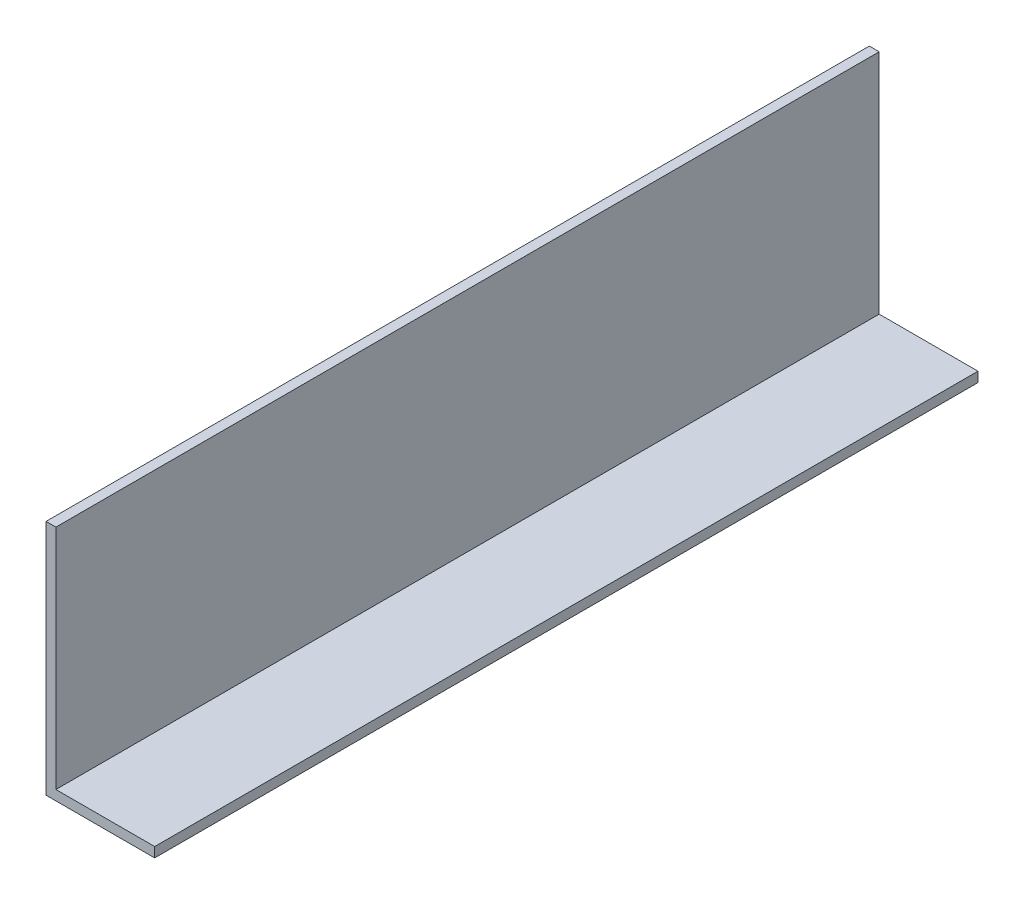
ISO-10303-21;
HEADER;
FILE_DESCRIPTION(('STEP AP214'),'2;1');
FILE_NAME('part.step','',(''),(''),'','','');
FILE_SCHEMA(('AUTOMOTIVE_DESIGN { 1 0 10303 214 1 1 1 1 }'));
ENDSEC;
DATA;
#1=APPLICATION_CONTEXT('core data for automotive mechanical design processes');
#2=APPLICATION_PROTOCOL_DEFINITION('international standard','automotive_design',2000,#1);
#3=PRODUCT_CONTEXT('',#1,'mechanical');
#4=PRODUCT('Part','Part','',(#3));
#5=PRODUCT_RELATED_PRODUCT_CATEGORY('part','',(#4));
#6=PRODUCT_DEFINITION_FORMATION('','',#4);
#7=PRODUCT_DEFINITION_CONTEXT('part definition',#1,'design');
#8=PRODUCT_DEFINITION('design','',#6,#7);
#9=PRODUCT_DEFINITION_SHAPE('','',#8);
#10=(LENGTH_UNIT() NAMED_UNIT(*) SI_UNIT(.MILLI.,.METRE.));
#11=(NAMED_UNIT(*) PLANE_ANGLE_UNIT() SI_UNIT($,.RADIAN.));
#12=(NAMED_UNIT(*) SI_UNIT($,.STERADIAN.) SOLID_ANGLE_UNIT());
#13=UNCERTAINTY_MEASURE_WITH_UNIT(LENGTH_MEASURE(1.E-05),#10,'distance_accuracy_value','');
#14=(GEOMETRIC_REPRESENTATION_CONTEXT(3) GLOBAL_UNCERTAINTY_ASSIGNED_CONTEXT((#13)) GLOBAL_UNIT_ASSIGNED_CONTEXT((#10,
#11,#12)) REPRESENTATION_CONTEXT('',''));
#15=CARTESIAN_POINT('',(0.,0.,0.));
#16=DIRECTION('',(0.,0.,1.));
#17=DIRECTION('',(1.,0.,0.));
#18=AXIS2_PLACEMENT_3D('',#15,#16,#17);
#19=CARTESIAN_POINT('',(0.,72.,250.));
#20=DIRECTION('',(0.,1.,0.));
#21=DIRECTION('',(0.,0.,1.));
#22=AXIS2_PLACEMENT_3D('',#19,#20,#21);
#23=PLANE('',#22);
#24=DIRECTION('',(1.,0.,0.));
#25=VECTOR('',#24,1.);
#26=CARTESIAN_POINT('',(0.,72.,0.));
#27=LINE('',#26,#25);
#28=CARTESIAN_POINT('',(0.,72.,0.));
#29=VERTEX_POINT('',#28);
#30=CARTESIAN_POINT('',(3.00000000000001,72.,0.));
#31=VERTEX_POINT('',#30);
#32=EDGE_CURVE('E121',#29,#31,#27,.T.);
#33=ORIENTED_EDGE('',*,*,#32,.F.);
#34=DIRECTION('',(0.,0.,-1.));
#35=VECTOR('',#34,1.);
#36=CARTESIAN_POINT('',(0.,72.,250.));
#37=LINE('',#36,#35);
#38=CARTESIAN_POINT('',(0.,72.,250.));
#39=VERTEX_POINT('',#38);
#40=EDGE_CURVE('E11',#39,#29,#37,.T.);
#41=ORIENTED_EDGE('',*,*,#40,.F.);
#42=DIRECTION('',(1.,0.,0.));
#43=VECTOR('',#42,1.);
#44=CARTESIAN_POINT('',(0.,72.,250.));
#45=LINE('',#44,#43);
#46=CARTESIAN_POINT('',(3.00000000000001,72.,250.));
#47=VERTEX_POINT('',#46);
#48=EDGE_CURVE('E132',#39,#47,#45,.T.);
#49=ORIENTED_EDGE('',*,*,#48,.T.);
#50=DIRECTION('',(0.,0.,-1.));
#51=VECTOR('',#50,1.);
#52=CARTESIAN_POINT('',(3.00000000000001,72.,250.));
#53=LINE('',#52,#51);
#54=EDGE_CURVE('E40',#47,#31,#53,.T.);
#55=ORIENTED_EDGE('',*,*,#54,.T.);
#56=EDGE_LOOP('',(#33,#41,#49,#55));
#57=FACE_BOUND('',#56,.T.);
#58=ADVANCED_FACE('F37',(#57),#23,.T.);
#59=CARTESIAN_POINT('',(0.,72.,250.));
#60=DIRECTION('',(1.,0.,0.));
#61=DIRECTION('',(0.,1.,0.));
#62=AXIS2_PLACEMENT_3D('',#59,#60,#61);
#63=PLANE('',#62);
#64=DIRECTION('',(0.,-1.,0.));
#65=VECTOR('',#64,1.);
#66=CARTESIAN_POINT('',(0.,72.,0.));
#67=LINE('',#66,#65);
#68=CARTESIAN_POINT('',(0.,0.,0.));
#69=VERTEX_POINT('',#68);
#70=EDGE_CURVE('E76',#29,#69,#67,.T.);
#71=ORIENTED_EDGE('',*,*,#70,.T.);
#72=DIRECTION('',(0.,0.,-1.));
#73=VECTOR('',#72,1.);
#74=CARTESIAN_POINT('',(0.,0.,250.));
#75=LINE('',#74,#73);
#76=CARTESIAN_POINT('',(0.,0.,250.));
#77=VERTEX_POINT('',#76);
#78=EDGE_CURVE('E46',#77,#69,#75,.T.);
#79=ORIENTED_EDGE('',*,*,#78,.F.);
#80=DIRECTION('',(0.,-1.,0.));
#81=VECTOR('',#80,1.);
#82=CARTESIAN_POINT('',(0.,72.,250.));
#83=LINE('',#82,#81);
#84=EDGE_CURVE('E100',#39,#77,#83,.T.);
#85=ORIENTED_EDGE('',*,*,#84,.F.);
#86=ORIENTED_EDGE('',*,*,#40,.T.);
#87=EDGE_LOOP('',(#71,#79,#85,#86));
#88=FACE_BOUND('',#87,.T.);
#89=ADVANCED_FACE('F155',(#88),#63,.F.);
#90=CARTESIAN_POINT('',(0.,0.,250.));
#91=DIRECTION('',(0.,1.,0.));
#92=DIRECTION('',(0.,0.,1.));
#93=AXIS2_PLACEMENT_3D('',#90,#91,#92);
#94=PLANE('',#93);
#95=DIRECTION('',(1.,0.,0.));
#96=VECTOR('',#95,1.);
#97=CARTESIAN_POINT('',(0.,0.,0.));
#98=LINE('',#97,#96);
#99=CARTESIAN_POINT('',(33.,0.,0.));
#100=VERTEX_POINT('',#99);
#101=EDGE_CURVE('E107',#69,#100,#98,.T.);
#102=ORIENTED_EDGE('',*,*,#101,.T.);
#103=DIRECTION('',(0.,0.,-1.));
#104=VECTOR('',#103,1.);
#105=CARTESIAN_POINT('',(33.,0.,250.));
#106=LINE('',#105,#104);
#107=CARTESIAN_POINT('',(33.,0.,250.));
#108=VERTEX_POINT('',#107);
#109=EDGE_CURVE('E104',#108,#100,#106,.T.);
#110=ORIENTED_EDGE('',*,*,#109,.F.);
#111=DIRECTION('',(1.,0.,0.));
#112=VECTOR('',#111,1.);
#113=CARTESIAN_POINT('',(0.,0.,250.));
#114=LINE('',#113,#112);
#115=EDGE_CURVE('E94',#77,#108,#114,.T.);
#116=ORIENTED_EDGE('',*,*,#115,.F.);
#117=ORIENTED_EDGE('',*,*,#78,.T.);
#118=EDGE_LOOP('',(#102,#110,#116,#117));
#119=FACE_BOUND('',#118,.T.);
#120=ADVANCED_FACE('F105',(#119),#94,.F.);
#121=CARTESIAN_POINT('',(33.,0.,250.));
#122=DIRECTION('',(-1.,0.,0.));
#123=DIRECTION('',(0.,0.,1.));
#124=AXIS2_PLACEMENT_3D('',#121,#122,#123);
#125=PLANE('',#124);
#126=DIRECTION('',(0.,1.,0.));
#127=VECTOR('',#126,1.);
#128=CARTESIAN_POINT('',(33.,0.,0.));
#129=LINE('',#128,#127);
#130=CARTESIAN_POINT('',(33.,3.,0.));
#131=VERTEX_POINT('',#130);
#132=EDGE_CURVE('E129',#100,#131,#129,.T.);
#133=ORIENTED_EDGE('',*,*,#132,.T.);
#134=DIRECTION('',(0.,0.,-1.));
#135=VECTOR('',#134,1.);
#136=CARTESIAN_POINT('',(33.,3.,250.));
#137=LINE('',#136,#135);
#138=CARTESIAN_POINT('',(33.,3.,250.));
#139=VERTEX_POINT('',#138);
#140=EDGE_CURVE('E110',#139,#131,#137,.T.);
#141=ORIENTED_EDGE('',*,*,#140,.F.);
#142=DIRECTION('',(0.,1.,0.));
#143=VECTOR('',#142,1.);
#144=CARTESIAN_POINT('',(33.,0.,250.));
#145=LINE('',#144,#143);
#146=EDGE_CURVE('E98',#108,#139,#145,.T.);
#147=ORIENTED_EDGE('',*,*,#146,.F.);
#148=ORIENTED_EDGE('',*,*,#109,.T.);
#149=EDGE_LOOP('',(#133,#141,#147,#148));
#150=FACE_BOUND('',#149,.T.);
#151=ADVANCED_FACE('F112',(#150),#125,.F.);
#152=CARTESIAN_POINT('',(33.,3.,250.));
#153=DIRECTION('',(0.,-1.,0.));
#154=DIRECTION('',(1.,0.,0.));
#155=AXIS2_PLACEMENT_3D('',#152,#153,#154);
#156=PLANE('',#155);
#157=DIRECTION('',(-1.,0.,0.));
#158=VECTOR('',#157,1.);
#159=CARTESIAN_POINT('',(33.,3.,0.));
#160=LINE('',#159,#158);
#161=CARTESIAN_POINT('',(3.00000000000001,3.,0.));
#162=VERTEX_POINT('',#161);
#163=EDGE_CURVE('E127',#131,#162,#160,.T.);
#164=ORIENTED_EDGE('',*,*,#163,.T.);
#165=DIRECTION('',(0.,0.,-1.));
#166=VECTOR('',#165,1.);
#167=CARTESIAN_POINT('',(3.00000000000001,3.,250.));
#168=LINE('',#167,#166);
#169=CARTESIAN_POINT('',(3.00000000000001,3.,250.));
#170=VERTEX_POINT('',#169);
#171=EDGE_CURVE('E135',#170,#162,#168,.T.);
#172=ORIENTED_EDGE('',*,*,#171,.F.);
#173=DIRECTION('',(-1.,0.,0.));
#174=VECTOR('',#173,1.);
#175=CARTESIAN_POINT('',(33.,3.,250.));
#176=LINE('',#175,#174);
#177=EDGE_CURVE('E115',#139,#170,#176,.T.);
#178=ORIENTED_EDGE('',*,*,#177,.F.);
#179=ORIENTED_EDGE('',*,*,#140,.T.);
#180=EDGE_LOOP('',(#164,#172,#178,#179));
#181=FACE_BOUND('',#180,.T.);
#182=ADVANCED_FACE('F145',(#181),#156,.F.);
#183=CARTESIAN_POINT('',(3.00000000000001,3.,250.));
#184=DIRECTION('',(-1.,0.,0.));
#185=DIRECTION('',(0.,-1.,0.));
#186=AXIS2_PLACEMENT_3D('',#183,#184,#185);
#187=PLANE('',#186);
#188=DIRECTION('',(0.,1.,0.));
#189=VECTOR('',#188,1.);
#190=CARTESIAN_POINT('',(3.00000000000001,3.,0.));
#191=LINE('',#190,#189);
#192=EDGE_CURVE('E124',#162,#31,#191,.T.);
#193=ORIENTED_EDGE('',*,*,#192,.T.);
#194=ORIENTED_EDGE('',*,*,#54,.F.);
#195=DIRECTION('',(0.,1.,0.));
#196=VECTOR('',#195,1.);
#197=CARTESIAN_POINT('',(3.00000000000001,3.,250.));
#198=LINE('',#197,#196);
#199=EDGE_CURVE('E86',#170,#47,#198,.T.);
#200=ORIENTED_EDGE('',*,*,#199,.F.);
#201=ORIENTED_EDGE('',*,*,#171,.T.);
#202=EDGE_LOOP('',(#193,#194,#200,#201));
#203=FACE_BOUND('',#202,.T.);
#204=ADVANCED_FACE('F140',(#203),#187,.F.);
#205=CARTESIAN_POINT('',(0.,0.,250.));
#206=DIRECTION('',(0.,0.,1.));
#207=DIRECTION('',(1.,0.,0.));
#208=AXIS2_PLACEMENT_3D('',#205,#206,#207);
#209=PLANE('',#208);
#210=ORIENTED_EDGE('',*,*,#48,.F.);
#211=ORIENTED_EDGE('',*,*,#84,.T.);
#212=ORIENTED_EDGE('',*,*,#115,.T.);
#213=ORIENTED_EDGE('',*,*,#146,.T.);
#214=ORIENTED_EDGE('',*,*,#177,.T.);
#215=ORIENTED_EDGE('',*,*,#199,.T.);
#216=EDGE_LOOP('',(#210,#211,#212,#213,#214,#215));
#217=FACE_BOUND('',#216,.T.);
#218=ADVANCED_FACE('F96',(#217),#209,.T.);
#219=CARTESIAN_POINT('',(0.,0.,0.));
#220=DIRECTION('',(0.,0.,1.));
#221=DIRECTION('',(1.,0.,0.));
#222=AXIS2_PLACEMENT_3D('',#219,#220,#221);
#223=PLANE('',#222);
#224=ORIENTED_EDGE('',*,*,#32,.T.);
#225=ORIENTED_EDGE('',*,*,#192,.F.);
#226=ORIENTED_EDGE('',*,*,#163,.F.);
#227=ORIENTED_EDGE('',*,*,#132,.F.);
#228=ORIENTED_EDGE('',*,*,#101,.F.);
#229=ORIENTED_EDGE('',*,*,#70,.F.);
#230=EDGE_LOOP('',(#224,#225,#226,#227,#228,#229));
#231=FACE_BOUND('',#230,.T.);
#232=ADVANCED_FACE('F143',(#231),#223,.F.);
#233=CLOSED_SHELL('',(#58,#89,#120,#151,#182,#204,#218,#232));
#234=MANIFOLD_SOLID_BREP('B2',#233);
#235=ADVANCED_BREP_SHAPE_REPRESENTATION('',(#18,#234),#14);
#236=SHAPE_DEFINITION_REPRESENTATION(#9,#235);
ENDSEC;
END-ISO-10303-21;
